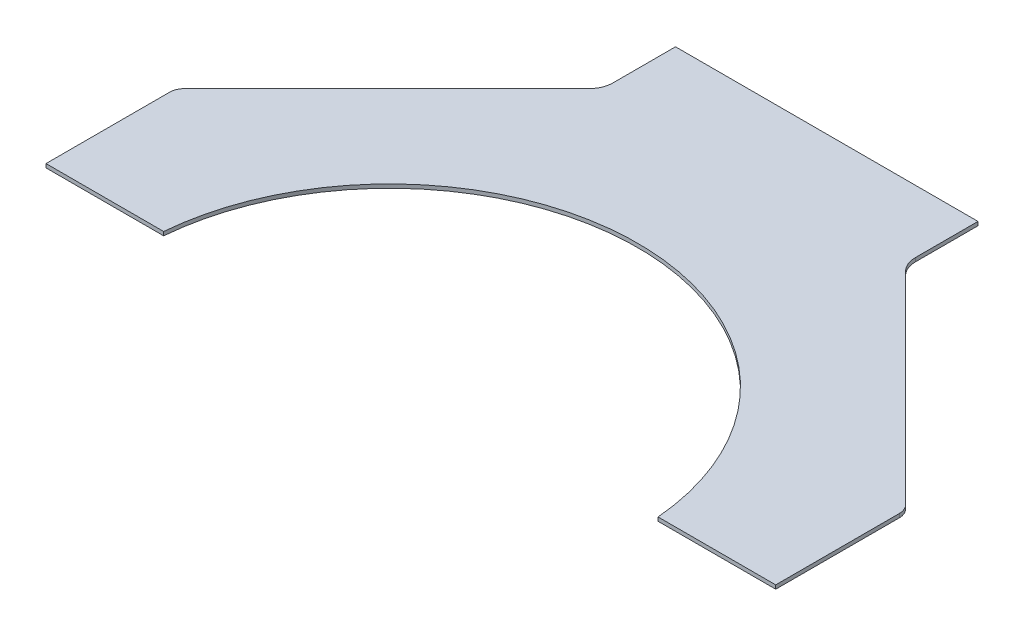
ISO-10303-21;
HEADER;
FILE_DESCRIPTION(('STEP AP214'),'2;1');
FILE_NAME('part.step','',(''),(''),'','','');
FILE_SCHEMA(('AUTOMOTIVE_DESIGN { 1 0 10303 214 1 1 1 1 }'));
ENDSEC;
DATA;
#1=APPLICATION_CONTEXT('core data for automotive mechanical design processes');
#2=APPLICATION_PROTOCOL_DEFINITION('international standard','automotive_design',2000,#1);
#3=PRODUCT_CONTEXT('',#1,'mechanical');
#4=PRODUCT('Part','Part','',(#3));
#5=PRODUCT_RELATED_PRODUCT_CATEGORY('part','',(#4));
#6=PRODUCT_DEFINITION_FORMATION('','',#4);
#7=PRODUCT_DEFINITION_CONTEXT('part definition',#1,'design');
#8=PRODUCT_DEFINITION('design','',#6,#7);
#9=PRODUCT_DEFINITION_SHAPE('','',#8);
#10=(LENGTH_UNIT() NAMED_UNIT(*) SI_UNIT(.MILLI.,.METRE.));
#11=(NAMED_UNIT(*) PLANE_ANGLE_UNIT() SI_UNIT($,.RADIAN.));
#12=(NAMED_UNIT(*) SI_UNIT($,.STERADIAN.) SOLID_ANGLE_UNIT());
#13=UNCERTAINTY_MEASURE_WITH_UNIT(LENGTH_MEASURE(1.E-05),#10,'distance_accuracy_value','');
#14=(GEOMETRIC_REPRESENTATION_CONTEXT(3) GLOBAL_UNCERTAINTY_ASSIGNED_CONTEXT((#13)) GLOBAL_UNIT_ASSIGNED_CONTEXT((#10,
#11,#12)) REPRESENTATION_CONTEXT('',''));
#15=CARTESIAN_POINT('',(0.,0.,0.));
#16=DIRECTION('',(0.,0.,1.));
#17=DIRECTION('',(1.,0.,0.));
#18=AXIS2_PLACEMENT_3D('',#15,#16,#17);
#19=CARTESIAN_POINT('',(-19.300000000127,-0.2,-7.66295090435026));
#20=DIRECTION('',(-1.,0.,0.));
#21=DIRECTION('',(0.,0.,1.));
#22=AXIS2_PLACEMENT_3D('',#19,#20,#21);
#23=PLANE('',#22);
#24=DIRECTION('',(0.,0.,1.));
#25=VECTOR('',#24,1.);
#26=CARTESIAN_POINT('',(-19.300000000127,0.,-7.66295090435026));
#27=LINE('',#26,#25);
#28=CARTESIAN_POINT('',(-19.300000000127,0.,-7.66295090435026));
#29=VERTEX_POINT('',#28);
#30=CARTESIAN_POINT('',(-19.300000000127,0.,-1.1250000003577));
#31=VERTEX_POINT('',#30);
#32=EDGE_CURVE('E166',#29,#31,#27,.T.);
#33=ORIENTED_EDGE('',*,*,#32,.F.);
#34=DIRECTION('',(0.,1.,0.));
#35=VECTOR('',#34,1.);
#36=CARTESIAN_POINT('',(-19.300000000127,-0.2,-7.66295090435026));
#37=LINE('',#36,#35);
#38=CARTESIAN_POINT('',(-19.300000000127,-0.2,-7.66295090435026));
#39=VERTEX_POINT('',#38);
#40=EDGE_CURVE('E11',#39,#29,#37,.T.);
#41=ORIENTED_EDGE('',*,*,#40,.F.);
#42=DIRECTION('',(0.,0.,1.));
#43=VECTOR('',#42,1.);
#44=CARTESIAN_POINT('',(-19.300000000127,-0.2,-7.66295090435026));
#45=LINE('',#44,#43);
#46=CARTESIAN_POINT('',(-19.300000000127,-0.2,-1.1250000003577));
#47=VERTEX_POINT('',#46);
#48=EDGE_CURVE('E204',#39,#47,#45,.T.);
#49=ORIENTED_EDGE('',*,*,#48,.T.);
#50=DIRECTION('',(0.,1.,0.));
#51=VECTOR('',#50,1.);
#52=CARTESIAN_POINT('',(-19.300000000127,-0.2,-1.1250000003577));
#53=LINE('',#52,#51);
#54=EDGE_CURVE('E36',#47,#31,#53,.T.);
#55=ORIENTED_EDGE('',*,*,#54,.T.);
#56=EDGE_LOOP('',(#33,#41,#49,#55));
#57=FACE_BOUND('',#56,.T.);
#58=ADVANCED_FACE('F33',(#57),#23,.T.);
#59=CARTESIAN_POINT('',(-18.5000000032024,-0.2,-7.66295090435026));
#60=DIRECTION('',(0.,1.,0.));
#61=DIRECTION('',(0.,0.,1.));
#62=AXIS2_PLACEMENT_3D('',#59,#60,#61);
#63=CYLINDRICAL_SURFACE('',#62,0.799999996924624);
#64=CARTESIAN_POINT('',(-18.5000000032024,0.,-7.66295090435026));
#65=DIRECTION('',(0.,1.,0.));
#66=DIRECTION('',(0.,0.,1.));
#67=AXIS2_PLACEMENT_3D('',#64,#65,#66);
#68=CIRCLE('',#67,0.799999996924624);
#69=CARTESIAN_POINT('',(-19.065685425977,0.,-8.22863632712488));
#70=VERTEX_POINT('',#69);
#71=EDGE_CURVE('E202',#70,#29,#68,.T.);
#72=ORIENTED_EDGE('',*,*,#71,.F.);
#73=DIRECTION('',(0.,1.,0.));
#74=VECTOR('',#73,1.);
#75=CARTESIAN_POINT('',(-19.065685425977,-0.2,-8.22863632712488));
#76=LINE('',#75,#74);
#77=CARTESIAN_POINT('',(-19.065685425977,-0.2,-8.22863632712488));
#78=VERTEX_POINT('',#77);
#79=EDGE_CURVE('E42',#78,#70,#76,.T.);
#80=ORIENTED_EDGE('',*,*,#79,.F.);
#81=CARTESIAN_POINT('',(-18.5000000032024,-0.2,-7.66295090435026));
#82=DIRECTION('',(0.,1.,0.));
#83=DIRECTION('',(0.,0.,1.));
#84=AXIS2_PLACEMENT_3D('',#81,#82,#83);
#85=CIRCLE('',#84,0.799999996924624);
#86=EDGE_CURVE('E156',#78,#39,#85,.T.);
#87=ORIENTED_EDGE('',*,*,#86,.T.);
#88=ORIENTED_EDGE('',*,*,#40,.T.);
#89=EDGE_LOOP('',(#72,#80,#87,#88));
#90=FACE_BOUND('',#89,.T.);
#91=ADVANCED_FACE('F228',(#90),#63,.T.);
#92=CARTESIAN_POINT('',(-8.36611652447877,-0.2,-18.9282052286231));
#93=DIRECTION('',(-0.707106781186548,0.,-0.707106781186548));
#94=DIRECTION('',(-0.707106781186548,0.,0.707106781186548));
#95=AXIS2_PLACEMENT_3D('',#92,#93,#94);
#96=PLANE('',#95);
#97=DIRECTION('',(-0.707106781186548,0.,0.707106781186548));
#98=VECTOR('',#97,1.);
#99=CARTESIAN_POINT('',(-8.36611652447877,0.,-18.9282052286231));
#100=LINE('',#99,#98);
#101=CARTESIAN_POINT('',(-8.36611652447877,0.,-18.9282052286231));
#102=VERTEX_POINT('',#101);
#103=EDGE_CURVE('E143',#102,#70,#100,.T.);
#104=ORIENTED_EDGE('',*,*,#103,.F.);
#105=DIRECTION('',(0.,1.,0.));
#106=VECTOR('',#105,1.);
#107=CARTESIAN_POINT('',(-8.36611652447877,-0.2,-18.9282052286231));
#108=LINE('',#107,#106);
#109=CARTESIAN_POINT('',(-8.36611652447877,-0.2,-18.9282052286231));
#110=VERTEX_POINT('',#109);
#111=EDGE_CURVE('E138',#110,#102,#108,.T.);
#112=ORIENTED_EDGE('',*,*,#111,.F.);
#113=DIRECTION('',(-0.707106781186548,0.,0.707106781186548));
#114=VECTOR('',#113,1.);
#115=CARTESIAN_POINT('',(-8.36611652447877,-0.2,-18.9282052286231));
#116=LINE('',#115,#114);
#117=EDGE_CURVE('E141',#110,#78,#116,.T.);
#118=ORIENTED_EDGE('',*,*,#117,.T.);
#119=ORIENTED_EDGE('',*,*,#79,.T.);
#120=EDGE_LOOP('',(#104,#112,#118,#119));
#121=FACE_BOUND('',#120,.T.);
#122=ADVANCED_FACE('F140',(#121),#96,.T.);
#123=CARTESIAN_POINT('',(-9.25000000228687,-0.2,-19.8120887064312));
#124=DIRECTION('',(0.,1.,0.));
#125=DIRECTION('',(0.,0.,1.));
#126=AXIS2_PLACEMENT_3D('',#123,#124,#125);
#127=CYLINDRICAL_SURFACE('',#126,1.25000000187371);
#128=CARTESIAN_POINT('',(-9.25000000228687,0.,-19.8120887064312));
#129=DIRECTION('',(0.,-1.,0.));
#130=DIRECTION('',(0.,0.,-1.));
#131=AXIS2_PLACEMENT_3D('',#128,#129,#130);
#132=CIRCLE('',#131,1.25000000187371);
#133=CARTESIAN_POINT('',(-8.00000000041316,0.,-19.8120887064312));
#134=VERTEX_POINT('',#133);
#135=EDGE_CURVE('E199',#134,#102,#132,.T.);
#136=ORIENTED_EDGE('',*,*,#135,.F.);
#137=DIRECTION('',(0.,1.,0.));
#138=VECTOR('',#137,1.);
#139=CARTESIAN_POINT('',(-8.00000000041316,-0.2,-19.8120887064312));
#140=LINE('',#139,#138);
#141=CARTESIAN_POINT('',(-8.00000000041316,-0.2,-19.8120887064312));
#142=VERTEX_POINT('',#141);
#143=EDGE_CURVE('E148',#142,#134,#140,.T.);
#144=ORIENTED_EDGE('',*,*,#143,.F.);
#145=CARTESIAN_POINT('',(-9.25000000228687,-0.2,-19.8120887064312));
#146=DIRECTION('',(0.,-1.,0.));
#147=DIRECTION('',(0.,0.,-1.));
#148=AXIS2_PLACEMENT_3D('',#145,#146,#147);
#149=CIRCLE('',#148,1.25000000187371);
#150=EDGE_CURVE('E154',#142,#110,#149,.T.);
#151=ORIENTED_EDGE('',*,*,#150,.T.);
#152=ORIENTED_EDGE('',*,*,#111,.T.);
#153=EDGE_LOOP('',(#136,#144,#151,#152));
#154=FACE_BOUND('',#153,.T.);
#155=ADVANCED_FACE('F158',(#154),#127,.F.);
#156=CARTESIAN_POINT('',(-8.00000000041316,-0.2,-23.1249999994319));
#157=DIRECTION('',(-1.,0.,0.));
#158=DIRECTION('',(0.,0.,1.));
#159=AXIS2_PLACEMENT_3D('',#156,#157,#158);
#160=PLANE('',#159);
#161=DIRECTION('',(0.,0.,1.));
#162=VECTOR('',#161,1.);
#163=CARTESIAN_POINT('',(-8.00000000041316,0.,-23.1249999994319));
#164=LINE('',#163,#162);
#165=CARTESIAN_POINT('',(-8.00000000041316,0.,-23.1249999994319));
#166=VERTEX_POINT('',#165);
#167=EDGE_CURVE('E196',#166,#134,#164,.T.);
#168=ORIENTED_EDGE('',*,*,#167,.F.);
#169=DIRECTION('',(0.,1.,0.));
#170=VECTOR('',#169,1.);
#171=CARTESIAN_POINT('',(-8.00000000041316,-0.2,-23.1249999994319));
#172=LINE('',#171,#170);
#173=CARTESIAN_POINT('',(-8.00000000041316,-0.2,-23.1249999994319));
#174=VERTEX_POINT('',#173);
#175=EDGE_CURVE('E208',#174,#166,#172,.T.);
#176=ORIENTED_EDGE('',*,*,#175,.F.);
#177=DIRECTION('',(0.,0.,1.));
#178=VECTOR('',#177,1.);
#179=CARTESIAN_POINT('',(-8.00000000041316,-0.2,-23.1249999994319));
#180=LINE('',#179,#178);
#181=EDGE_CURVE('E159',#174,#142,#180,.T.);
#182=ORIENTED_EDGE('',*,*,#181,.T.);
#183=ORIENTED_EDGE('',*,*,#143,.T.);
#184=EDGE_LOOP('',(#168,#176,#182,#183));
#185=FACE_BOUND('',#184,.T.);
#186=ADVANCED_FACE('F241',(#185),#160,.T.);
#187=CARTESIAN_POINT('',(8.00000000041316,-0.2,-23.1249999994319));
#188=DIRECTION('',(0.,0.,-1.));
#189=DIRECTION('',(-1.,0.,0.));
#190=AXIS2_PLACEMENT_3D('',#187,#188,#189);
#191=PLANE('',#190);
#192=DIRECTION('',(-1.,0.,0.));
#193=VECTOR('',#192,1.);
#194=CARTESIAN_POINT('',(8.00000000041316,0.,-23.1249999994319));
#195=LINE('',#194,#193);
#196=CARTESIAN_POINT('',(8.00000000041316,0.,-23.1249999994319));
#197=VERTEX_POINT('',#196);
#198=EDGE_CURVE('E193',#197,#166,#195,.T.);
#199=ORIENTED_EDGE('',*,*,#198,.F.);
#200=DIRECTION('',(0.,1.,0.));
#201=VECTOR('',#200,1.);
#202=CARTESIAN_POINT('',(8.00000000041316,-0.2,-23.1249999994319));
#203=LINE('',#202,#201);
#204=CARTESIAN_POINT('',(8.00000000041316,-0.2,-23.1249999994319));
#205=VERTEX_POINT('',#204);
#206=EDGE_CURVE('E210',#205,#197,#203,.T.);
#207=ORIENTED_EDGE('',*,*,#206,.F.);
#208=DIRECTION('',(-1.,0.,0.));
#209=VECTOR('',#208,1.);
#210=CARTESIAN_POINT('',(8.00000000041316,-0.2,-23.1249999994319));
#211=LINE('',#210,#209);
#212=EDGE_CURVE('E161',#205,#174,#211,.T.);
#213=ORIENTED_EDGE('',*,*,#212,.T.);
#214=ORIENTED_EDGE('',*,*,#175,.T.);
#215=EDGE_LOOP('',(#199,#207,#213,#214));
#216=FACE_BOUND('',#215,.T.);
#217=ADVANCED_FACE('F244',(#216),#191,.T.);
#218=CARTESIAN_POINT('',(8.00000000041316,-0.2,-19.8120887064312));
#219=DIRECTION('',(1.,0.,0.));
#220=DIRECTION('',(0.,0.,-1.));
#221=AXIS2_PLACEMENT_3D('',#218,#219,#220);
#222=PLANE('',#221);
#223=DIRECTION('',(0.,0.,-1.));
#224=VECTOR('',#223,1.);
#225=CARTESIAN_POINT('',(8.00000000041316,0.,-19.8120887064312));
#226=LINE('',#225,#224);
#227=CARTESIAN_POINT('',(8.00000000041316,0.,-19.8120887064312));
#228=VERTEX_POINT('',#227);
#229=EDGE_CURVE('E190',#228,#197,#226,.T.);
#230=ORIENTED_EDGE('',*,*,#229,.F.);
#231=DIRECTION('',(0.,1.,0.));
#232=VECTOR('',#231,1.);
#233=CARTESIAN_POINT('',(8.00000000041316,-0.2,-19.8120887064312));
#234=LINE('',#233,#232);
#235=CARTESIAN_POINT('',(8.00000000041316,-0.2,-19.8120887064312));
#236=VERTEX_POINT('',#235);
#237=EDGE_CURVE('E212',#236,#228,#234,.T.);
#238=ORIENTED_EDGE('',*,*,#237,.F.);
#239=DIRECTION('',(0.,0.,-1.));
#240=VECTOR('',#239,1.);
#241=CARTESIAN_POINT('',(8.00000000041316,-0.2,-19.8120887064312));
#242=LINE('',#241,#240);
#243=EDGE_CURVE('E401',#236,#205,#242,.T.);
#244=ORIENTED_EDGE('',*,*,#243,.T.);
#245=ORIENTED_EDGE('',*,*,#206,.T.);
#246=EDGE_LOOP('',(#230,#238,#244,#245));
#247=FACE_BOUND('',#246,.T.);
#248=ADVANCED_FACE('F248',(#247),#222,.T.);
#249=CARTESIAN_POINT('',(9.25000000228687,-0.2,-19.8120887064312));
#250=DIRECTION('',(0.,1.,0.));
#251=DIRECTION('',(0.,0.,1.));
#252=AXIS2_PLACEMENT_3D('',#249,#250,#251);
#253=CYLINDRICAL_SURFACE('',#252,1.25000000187371);
#254=CARTESIAN_POINT('',(9.25000000228687,0.,-19.8120887064312));
#255=DIRECTION('',(0.,-1.,0.));
#256=DIRECTION('',(0.,0.,-1.));
#257=AXIS2_PLACEMENT_3D('',#254,#255,#256);
#258=CIRCLE('',#257,1.25000000187371);
#259=CARTESIAN_POINT('',(8.36611652447878,0.,-18.9282052286231));
#260=VERTEX_POINT('',#259);
#261=EDGE_CURVE('E187',#260,#228,#258,.T.);
#262=ORIENTED_EDGE('',*,*,#261,.F.);
#263=DIRECTION('',(0.,1.,0.));
#264=VECTOR('',#263,1.);
#265=CARTESIAN_POINT('',(8.36611652447878,-0.2,-18.9282052286231));
#266=LINE('',#265,#264);
#267=CARTESIAN_POINT('',(8.36611652447878,-0.2,-18.9282052286231));
#268=VERTEX_POINT('',#267);
#269=EDGE_CURVE('E214',#268,#260,#266,.T.);
#270=ORIENTED_EDGE('',*,*,#269,.F.);
#271=CARTESIAN_POINT('',(9.25000000228687,-0.2,-19.8120887064312));
#272=DIRECTION('',(0.,-1.,0.));
#273=DIRECTION('',(0.,0.,-1.));
#274=AXIS2_PLACEMENT_3D('',#271,#272,#273);
#275=CIRCLE('',#274,1.25000000187371);
#276=EDGE_CURVE('E394',#268,#236,#275,.T.);
#277=ORIENTED_EDGE('',*,*,#276,.T.);
#278=ORIENTED_EDGE('',*,*,#237,.T.);
#279=EDGE_LOOP('',(#262,#270,#277,#278));
#280=FACE_BOUND('',#279,.T.);
#281=ADVANCED_FACE('F252',(#280),#253,.F.);
#282=CARTESIAN_POINT('',(19.065685425977,-0.2,-8.22863632712489));
#283=DIRECTION('',(0.707106781186547,0.,-0.707106781186548));
#284=DIRECTION('',(-0.707106781186548,0.,-0.707106781186547));
#285=AXIS2_PLACEMENT_3D('',#282,#283,#284);
#286=PLANE('',#285);
#287=DIRECTION('',(-0.707106781186548,0.,-0.707106781186547));
#288=VECTOR('',#287,1.);
#289=CARTESIAN_POINT('',(19.065685425977,0.,-8.22863632712489));
#290=LINE('',#289,#288);
#291=CARTESIAN_POINT('',(19.065685425977,0.,-8.22863632712489));
#292=VERTEX_POINT('',#291);
#293=EDGE_CURVE('E184',#292,#260,#290,.T.);
#294=ORIENTED_EDGE('',*,*,#293,.F.);
#295=DIRECTION('',(0.,1.,0.));
#296=VECTOR('',#295,1.);
#297=CARTESIAN_POINT('',(19.065685425977,-0.2,-8.22863632712489));
#298=LINE('',#297,#296);
#299=CARTESIAN_POINT('',(19.065685425977,-0.2,-8.22863632712489));
#300=VERTEX_POINT('',#299);
#301=EDGE_CURVE('E216',#300,#292,#298,.T.);
#302=ORIENTED_EDGE('',*,*,#301,.F.);
#303=DIRECTION('',(-0.707106781186548,0.,-0.707106781186547));
#304=VECTOR('',#303,1.);
#305=CARTESIAN_POINT('',(19.065685425977,-0.2,-8.22863632712489));
#306=LINE('',#305,#304);
#307=EDGE_CURVE('E390',#300,#268,#306,.T.);
#308=ORIENTED_EDGE('',*,*,#307,.T.);
#309=ORIENTED_EDGE('',*,*,#269,.T.);
#310=EDGE_LOOP('',(#294,#302,#308,#309));
#311=FACE_BOUND('',#310,.T.);
#312=ADVANCED_FACE('F256',(#311),#286,.T.);
#313=CARTESIAN_POINT('',(18.5000000032024,-0.2,-7.66295090435026));
#314=DIRECTION('',(0.,1.,0.));
#315=DIRECTION('',(0.,0.,1.));
#316=AXIS2_PLACEMENT_3D('',#313,#314,#315);
#317=CYLINDRICAL_SURFACE('',#316,0.799999996924626);
#318=CARTESIAN_POINT('',(18.5000000032024,0.,-7.66295090435026));
#319=DIRECTION('',(0.,1.,0.));
#320=DIRECTION('',(0.,0.,1.));
#321=AXIS2_PLACEMENT_3D('',#318,#319,#320);
#322=CIRCLE('',#321,0.799999996924626);
#323=CARTESIAN_POINT('',(19.300000000127,0.,-7.66295090435026));
#324=VERTEX_POINT('',#323);
#325=EDGE_CURVE('E181',#324,#292,#322,.T.);
#326=ORIENTED_EDGE('',*,*,#325,.F.);
#327=DIRECTION('',(0.,1.,0.));
#328=VECTOR('',#327,1.);
#329=CARTESIAN_POINT('',(19.300000000127,-0.2,-7.66295090435026));
#330=LINE('',#329,#328);
#331=CARTESIAN_POINT('',(19.300000000127,-0.2,-7.66295090435026));
#332=VERTEX_POINT('',#331);
#333=EDGE_CURVE('E218',#332,#324,#330,.T.);
#334=ORIENTED_EDGE('',*,*,#333,.F.);
#335=CARTESIAN_POINT('',(18.5000000032024,-0.2,-7.66295090435026));
#336=DIRECTION('',(0.,1.,0.));
#337=DIRECTION('',(0.,0.,1.));
#338=AXIS2_PLACEMENT_3D('',#335,#336,#337);
#339=CIRCLE('',#338,0.799999996924626);
#340=EDGE_CURVE('E406',#332,#300,#339,.T.);
#341=ORIENTED_EDGE('',*,*,#340,.T.);
#342=ORIENTED_EDGE('',*,*,#301,.T.);
#343=EDGE_LOOP('',(#326,#334,#341,#342));
#344=FACE_BOUND('',#343,.T.);
#345=ADVANCED_FACE('F260',(#344),#317,.T.);
#346=CARTESIAN_POINT('',(19.300000000127,-0.2,-1.12500000035771));
#347=DIRECTION('',(1.,0.,0.));
#348=DIRECTION('',(0.,0.,-1.));
#349=AXIS2_PLACEMENT_3D('',#346,#347,#348);
#350=PLANE('',#349);
#351=DIRECTION('',(0.,0.,-1.));
#352=VECTOR('',#351,1.);
#353=CARTESIAN_POINT('',(19.300000000127,0.,-1.12500000035771));
#354=LINE('',#353,#352);
#355=CARTESIAN_POINT('',(19.300000000127,0.,-1.12500000035771));
#356=VERTEX_POINT('',#355);
#357=EDGE_CURVE('E178',#356,#324,#354,.T.);
#358=ORIENTED_EDGE('',*,*,#357,.F.);
#359=DIRECTION('',(0.,1.,0.));
#360=VECTOR('',#359,1.);
#361=CARTESIAN_POINT('',(19.300000000127,-0.2,-1.12500000035771));
#362=LINE('',#361,#360);
#363=CARTESIAN_POINT('',(19.300000000127,-0.2,-1.12500000035771));
#364=VERTEX_POINT('',#363);
#365=EDGE_CURVE('E220',#364,#356,#362,.T.);
#366=ORIENTED_EDGE('',*,*,#365,.F.);
#367=DIRECTION('',(0.,0.,-1.));
#368=VECTOR('',#367,1.);
#369=CARTESIAN_POINT('',(19.300000000127,-0.2,-1.12500000035771));
#370=LINE('',#369,#368);
#371=EDGE_CURVE('E383',#364,#332,#370,.T.);
#372=ORIENTED_EDGE('',*,*,#371,.T.);
#373=ORIENTED_EDGE('',*,*,#333,.T.);
#374=EDGE_LOOP('',(#358,#366,#372,#373));
#375=FACE_BOUND('',#374,.T.);
#376=ADVANCED_FACE('F264',(#375),#350,.T.);
#377=CARTESIAN_POINT('',(13.0766968306857,-0.2,-1.1250000003577));
#378=DIRECTION('',(0.,0.,1.));
#379=DIRECTION('',(1.,0.,0.));
#380=AXIS2_PLACEMENT_3D('',#377,#378,#379);
#381=PLANE('',#380);
#382=DIRECTION('',(1.,0.,0.));
#383=VECTOR('',#382,1.);
#384=CARTESIAN_POINT('',(13.0766968306857,0.,-1.1250000003577));
#385=LINE('',#384,#383);
#386=CARTESIAN_POINT('',(13.0766968306857,0.,-1.12500000035771));
#387=VERTEX_POINT('',#386);
#388=EDGE_CURVE('E175',#387,#356,#385,.T.);
#389=ORIENTED_EDGE('',*,*,#388,.F.);
#390=DIRECTION('',(0.,1.,0.));
#391=VECTOR('',#390,1.);
#392=CARTESIAN_POINT('',(13.0766968306857,-0.2,-1.12500000035771));
#393=LINE('',#392,#391);
#394=CARTESIAN_POINT('',(13.0766968306857,-0.2,-1.12500000035771));
#395=VERTEX_POINT('',#394);
#396=EDGE_CURVE('E222',#395,#387,#393,.T.);
#397=ORIENTED_EDGE('',*,*,#396,.F.);
#398=DIRECTION('',(1.,0.,0.));
#399=VECTOR('',#398,1.);
#400=CARTESIAN_POINT('',(13.0766968306857,-0.2,-1.1250000003577));
#401=LINE('',#400,#399);
#402=EDGE_CURVE('E379',#395,#364,#401,.T.);
#403=ORIENTED_EDGE('',*,*,#402,.T.);
#404=ORIENTED_EDGE('',*,*,#365,.T.);
#405=EDGE_LOOP('',(#389,#397,#403,#404));
#406=FACE_BOUND('',#405,.T.);
#407=ADVANCED_FACE('F268',(#406),#381,.T.);
#408=CARTESIAN_POINT('',(0.,-0.2,0.));
#409=DIRECTION('',(0.,1.,0.));
#410=DIRECTION('',(0.,0.,1.));
#411=AXIS2_PLACEMENT_3D('',#408,#409,#410);
#412=CYLINDRICAL_SURFACE('',#411,13.1250000000941);
#413=CARTESIAN_POINT('',(0.,0.,0.));
#414=DIRECTION('',(0.,-1.,0.));
#415=DIRECTION('',(0.,0.,-1.));
#416=AXIS2_PLACEMENT_3D('',#413,#414,#415);
#417=CIRCLE('',#416,13.1250000000941);
#418=CARTESIAN_POINT('',(-13.0766968306857,0.,-1.1250000003577));
#419=VERTEX_POINT('',#418);
#420=EDGE_CURVE('E172',#419,#387,#417,.T.);
#421=ORIENTED_EDGE('',*,*,#420,.F.);
#422=DIRECTION('',(0.,1.,0.));
#423=VECTOR('',#422,1.);
#424=CARTESIAN_POINT('',(-13.0766968306857,-0.2,-1.1250000003577));
#425=LINE('',#424,#423);
#426=CARTESIAN_POINT('',(-13.0766968306857,-0.2,-1.1250000003577));
#427=VERTEX_POINT('',#426);
#428=EDGE_CURVE('E223',#427,#419,#425,.T.);
#429=ORIENTED_EDGE('',*,*,#428,.F.);
#430=CARTESIAN_POINT('',(0.,-0.2,0.));
#431=DIRECTION('',(0.,-1.,0.));
#432=DIRECTION('',(0.,0.,-1.));
#433=AXIS2_PLACEMENT_3D('',#430,#431,#432);
#434=CIRCLE('',#433,13.1250000000941);
#435=EDGE_CURVE('E410',#427,#395,#434,.T.);
#436=ORIENTED_EDGE('',*,*,#435,.T.);
#437=ORIENTED_EDGE('',*,*,#396,.T.);
#438=EDGE_LOOP('',(#421,#429,#436,#437));
#439=FACE_BOUND('',#438,.T.);
#440=ADVANCED_FACE('F272',(#439),#412,.F.);
#441=CARTESIAN_POINT('',(-19.300000000127,-0.2,-1.1250000003577));
#442=DIRECTION('',(0.,0.,1.));
#443=DIRECTION('',(1.,0.,0.));
#444=AXIS2_PLACEMENT_3D('',#441,#442,#443);
#445=PLANE('',#444);
#446=DIRECTION('',(1.,0.,0.));
#447=VECTOR('',#446,1.);
#448=CARTESIAN_POINT('',(-19.300000000127,0.,-1.1250000003577));
#449=LINE('',#448,#447);
#450=EDGE_CURVE('E169',#31,#419,#449,.T.);
#451=ORIENTED_EDGE('',*,*,#450,.F.);
#452=ORIENTED_EDGE('',*,*,#54,.F.);
#453=DIRECTION('',(1.,0.,0.));
#454=VECTOR('',#453,1.);
#455=CARTESIAN_POINT('',(-19.300000000127,-0.2,-1.1250000003577));
#456=LINE('',#455,#454);
#457=EDGE_CURVE('E412',#47,#427,#456,.T.);
#458=ORIENTED_EDGE('',*,*,#457,.T.);
#459=ORIENTED_EDGE('',*,*,#428,.T.);
#460=EDGE_LOOP('',(#451,#452,#458,#459));
#461=FACE_BOUND('',#460,.T.);
#462=ADVANCED_FACE('F225',(#461),#445,.T.);
#463=CARTESIAN_POINT('',(0.,-0.2,0.));
#464=DIRECTION('',(0.,-1.,0.));
#465=DIRECTION('',(0.,0.,-1.));
#466=AXIS2_PLACEMENT_3D('',#463,#464,#465);
#467=PLANE('',#466);
#468=ORIENTED_EDGE('',*,*,#48,.F.);
#469=ORIENTED_EDGE('',*,*,#86,.F.);
#470=ORIENTED_EDGE('',*,*,#117,.F.);
#471=ORIENTED_EDGE('',*,*,#150,.F.);
#472=ORIENTED_EDGE('',*,*,#181,.F.);
#473=ORIENTED_EDGE('',*,*,#212,.F.);
#474=ORIENTED_EDGE('',*,*,#243,.F.);
#475=ORIENTED_EDGE('',*,*,#276,.F.);
#476=ORIENTED_EDGE('',*,*,#307,.F.);
#477=ORIENTED_EDGE('',*,*,#340,.F.);
#478=ORIENTED_EDGE('',*,*,#371,.F.);
#479=ORIENTED_EDGE('',*,*,#402,.F.);
#480=ORIENTED_EDGE('',*,*,#435,.F.);
#481=ORIENTED_EDGE('',*,*,#457,.F.);
#482=EDGE_LOOP('',(#468,#469,#470,#471,#472,#473,#474,#475,#476,#477,#478,#479,#480,#481));
#483=FACE_BOUND('',#482,.T.);
#484=ADVANCED_FACE('F152',(#483),#467,.T.);
#485=CARTESIAN_POINT('',(0.,0.,0.));
#486=DIRECTION('',(0.,-1.,0.));
#487=DIRECTION('',(0.,0.,-1.));
#488=AXIS2_PLACEMENT_3D('',#485,#486,#487);
#489=PLANE('',#488);
#490=ORIENTED_EDGE('',*,*,#32,.T.);
#491=ORIENTED_EDGE('',*,*,#450,.T.);
#492=ORIENTED_EDGE('',*,*,#420,.T.);
#493=ORIENTED_EDGE('',*,*,#388,.T.);
#494=ORIENTED_EDGE('',*,*,#357,.T.);
#495=ORIENTED_EDGE('',*,*,#325,.T.);
#496=ORIENTED_EDGE('',*,*,#293,.T.);
#497=ORIENTED_EDGE('',*,*,#261,.T.);
#498=ORIENTED_EDGE('',*,*,#229,.T.);
#499=ORIENTED_EDGE('',*,*,#198,.T.);
#500=ORIENTED_EDGE('',*,*,#167,.T.);
#501=ORIENTED_EDGE('',*,*,#135,.T.);
#502=ORIENTED_EDGE('',*,*,#103,.T.);
#503=ORIENTED_EDGE('',*,*,#71,.T.);
#504=EDGE_LOOP('',(#490,#491,#492,#493,#494,#495,#496,#497,#498,#499,#500,#501,#502,#503));
#505=FACE_BOUND('',#504,.T.);
#506=ADVANCED_FACE('F227',(#505),#489,.F.);
#507=CLOSED_SHELL('',(#58,#91,#122,#155,#186,#217,#248,#281,#312,#345,#376,#407,#440,#462,#484,#506));
#508=MANIFOLD_SOLID_BREP('B2',#507);
#509=ADVANCED_BREP_SHAPE_REPRESENTATION('',(#18,#508),#14);
#510=SHAPE_DEFINITION_REPRESENTATION(#9,#509);
ENDSEC;
END-ISO-10303-21;
